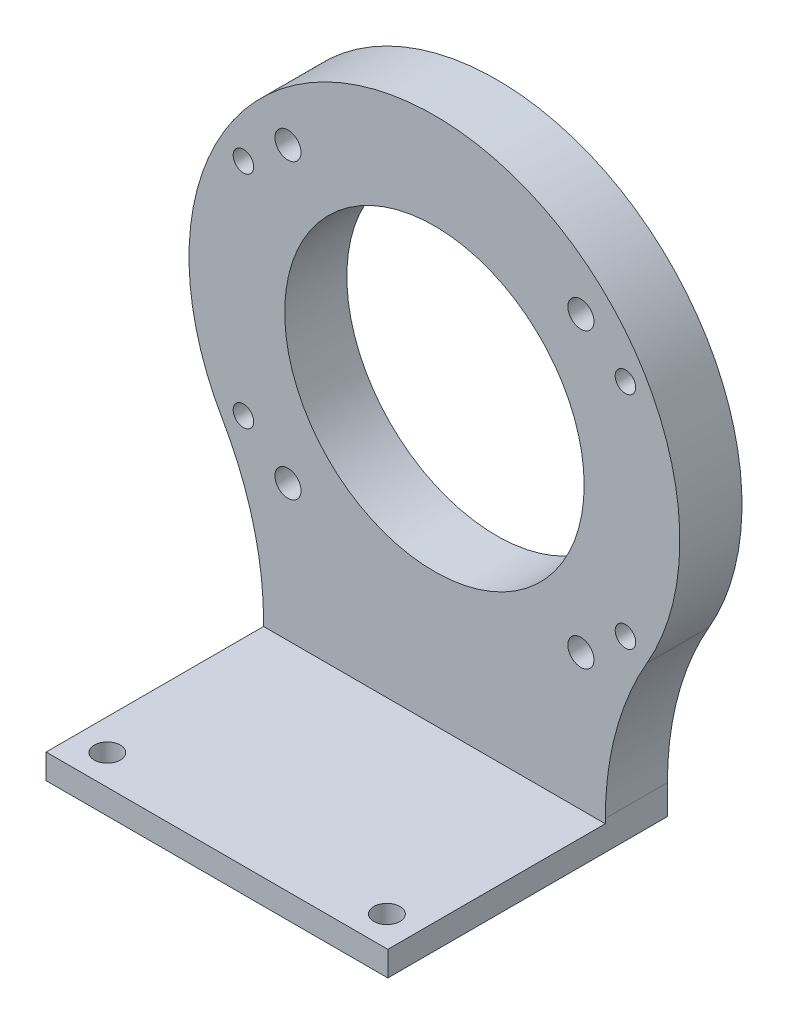
ISO-10303-21;
HEADER;
FILE_DESCRIPTION(('STEP AP214'),'2;1');
FILE_NAME('part.step','',(''),(''),'','','');
FILE_SCHEMA(('AUTOMOTIVE_DESIGN { 1 0 10303 214 1 1 1 1 }'));
ENDSEC;
DATA;
#1=APPLICATION_CONTEXT('core data for automotive mechanical design processes');
#2=APPLICATION_PROTOCOL_DEFINITION('international standard','automotive_design',2000,#1);
#3=PRODUCT_CONTEXT('',#1,'mechanical');
#4=PRODUCT('Part','Part','',(#3));
#5=PRODUCT_RELATED_PRODUCT_CATEGORY('part','',(#4));
#6=PRODUCT_DEFINITION_FORMATION('','',#4);
#7=PRODUCT_DEFINITION_CONTEXT('part definition',#1,'design');
#8=PRODUCT_DEFINITION('design','',#6,#7);
#9=PRODUCT_DEFINITION_SHAPE('','',#8);
#10=(LENGTH_UNIT() NAMED_UNIT(*) SI_UNIT(.MILLI.,.METRE.));
#11=(NAMED_UNIT(*) PLANE_ANGLE_UNIT() SI_UNIT($,.RADIAN.));
#12=(NAMED_UNIT(*) SI_UNIT($,.STERADIAN.) SOLID_ANGLE_UNIT());
#13=UNCERTAINTY_MEASURE_WITH_UNIT(LENGTH_MEASURE(1.E-05),#10,'distance_accuracy_value','');
#14=(GEOMETRIC_REPRESENTATION_CONTEXT(3) GLOBAL_UNCERTAINTY_ASSIGNED_CONTEXT((#13)) GLOBAL_UNIT_ASSIGNED_CONTEXT((#10,
#11,#12)) REPRESENTATION_CONTEXT('',''));
#15=CARTESIAN_POINT('',(0.,0.,0.));
#16=DIRECTION('',(0.,0.,1.));
#17=DIRECTION('',(1.,0.,0.));
#18=AXIS2_PLACEMENT_3D('',#15,#16,#17);
#19=CARTESIAN_POINT('',(0.,0.,10.));
#20=DIRECTION('',(0.,0.,1.));
#21=DIRECTION('',(1.,0.,0.));
#22=AXIS2_PLACEMENT_3D('',#19,#20,#21);
#23=PLANE('',#22);
#24=CARTESIAN_POINT('',(-30.7439018343476,-17.75,10.));
#25=DIRECTION('',(0.,0.,1.));
#26=DIRECTION('',(1.,0.,0.));
#27=AXIS2_PLACEMENT_3D('',#24,#25,#26);
#28=CIRCLE('',#27,1.65);
#29=CARTESIAN_POINT('',(-29.0939018343476,-17.75,10.));
#30=VERTEX_POINT('',#29);
#31=EDGE_CURVE('E184',#30,#30,#28,.T.);
#32=ORIENTED_EDGE('',*,*,#31,.F.);
#33=EDGE_LOOP('',(#32));
#34=FACE_BOUND('',#33,.T.);
#35=CARTESIAN_POINT('',(-30.7439018343476,17.75,10.));
#36=DIRECTION('',(0.,0.,1.));
#37=DIRECTION('',(1.,0.,0.));
#38=AXIS2_PLACEMENT_3D('',#35,#36,#37);
#39=CIRCLE('',#38,1.65);
#40=CARTESIAN_POINT('',(-29.0939018343476,17.75,10.));
#41=VERTEX_POINT('',#40);
#42=EDGE_CURVE('E192',#41,#41,#39,.T.);
#43=ORIENTED_EDGE('',*,*,#42,.F.);
#44=EDGE_LOOP('',(#43));
#45=FACE_BOUND('',#44,.T.);
#46=CARTESIAN_POINT('',(30.7439018343476,17.75,10.));
#47=DIRECTION('',(0.,0.,1.));
#48=DIRECTION('',(1.,0.,0.));
#49=AXIS2_PLACEMENT_3D('',#46,#47,#48);
#50=CIRCLE('',#49,1.65);
#51=CARTESIAN_POINT('',(32.3939018343476,17.75,10.));
#52=VERTEX_POINT('',#51);
#53=EDGE_CURVE('E200',#52,#52,#50,.T.);
#54=ORIENTED_EDGE('',*,*,#53,.F.);
#55=EDGE_LOOP('',(#54));
#56=FACE_BOUND('',#55,.T.);
#57=CARTESIAN_POINT('',(30.7439018343476,-17.75,10.));
#58=DIRECTION('',(0.,0.,1.));
#59=DIRECTION('',(1.,0.,0.));
#60=AXIS2_PLACEMENT_3D('',#57,#58,#59);
#61=CIRCLE('',#60,1.65);
#62=CARTESIAN_POINT('',(32.3939018343476,-17.75,10.));
#63=VERTEX_POINT('',#62);
#64=EDGE_CURVE('E208',#63,#63,#61,.T.);
#65=ORIENTED_EDGE('',*,*,#64,.F.);
#66=EDGE_LOOP('',(#65));
#67=FACE_BOUND('',#66,.T.);
#68=CARTESIAN_POINT('',(23.5731723178065,23.5731723178065,10.));
#69=DIRECTION('',(0.,0.,-1.));
#70=DIRECTION('',(-1.,0.,0.));
#71=AXIS2_PLACEMENT_3D('',#68,#69,#70);
#72=CIRCLE('',#71,2.1);
#73=CARTESIAN_POINT('',(21.4731723178065,23.5731723178065,10.));
#74=VERTEX_POINT('',#73);
#75=EDGE_CURVE('E220',#74,#74,#72,.T.);
#76=ORIENTED_EDGE('',*,*,#75,.T.);
#77=EDGE_LOOP('',(#76));
#78=FACE_BOUND('',#77,.T.);
#79=CARTESIAN_POINT('',(-23.5731723178065,23.5731723178065,10.));
#80=DIRECTION('',(0.,0.,-1.));
#81=DIRECTION('',(-1.,0.,0.));
#82=AXIS2_PLACEMENT_3D('',#79,#80,#81);
#83=CIRCLE('',#82,2.1);
#84=CARTESIAN_POINT('',(-25.6731723178065,23.5731723178065,10.));
#85=VERTEX_POINT('',#84);
#86=EDGE_CURVE('E228',#85,#85,#83,.T.);
#87=ORIENTED_EDGE('',*,*,#86,.T.);
#88=EDGE_LOOP('',(#87));
#89=FACE_BOUND('',#88,.T.);
#90=CARTESIAN_POINT('',(-23.5731723178065,-23.5731723178065,10.));
#91=DIRECTION('',(0.,0.,-1.));
#92=DIRECTION('',(-1.,0.,0.));
#93=AXIS2_PLACEMENT_3D('',#90,#91,#92);
#94=CIRCLE('',#93,2.1);
#95=CARTESIAN_POINT('',(-25.6731723178065,-23.5731723178065,10.));
#96=VERTEX_POINT('',#95);
#97=EDGE_CURVE('E236',#96,#96,#94,.T.);
#98=ORIENTED_EDGE('',*,*,#97,.T.);
#99=EDGE_LOOP('',(#98));
#100=FACE_BOUND('',#99,.T.);
#101=CARTESIAN_POINT('',(23.5731723178065,-23.5731723178065,10.));
#102=DIRECTION('',(0.,0.,-1.));
#103=DIRECTION('',(-1.,0.,0.));
#104=AXIS2_PLACEMENT_3D('',#101,#102,#103);
#105=CIRCLE('',#104,2.1);
#106=CARTESIAN_POINT('',(21.4731723178065,-23.5731723178065,10.));
#107=VERTEX_POINT('',#106);
#108=EDGE_CURVE('E244',#107,#107,#105,.T.);
#109=ORIENTED_EDGE('',*,*,#108,.T.);
#110=EDGE_LOOP('',(#109));
#111=FACE_BOUND('',#110,.T.);
#112=DIRECTION('',(0.,1.,0.));
#113=VECTOR('',#112,1.);
#114=CARTESIAN_POINT('',(27.5,-28.3548937575156,10.));
#115=LINE('',#114,#113);
#116=CARTESIAN_POINT('',(27.5,-45.5,10.));
#117=VERTEX_POINT('',#116);
#118=CARTESIAN_POINT('',(27.5,-44.7660585711988,10.));
#119=VERTEX_POINT('',#118);
#120=EDGE_CURVE('E272',#117,#119,#115,.T.);
#121=ORIENTED_EDGE('',*,*,#120,.T.);
#122=CARTESIAN_POINT('',(77.5,-44.7660585711988,10.));
#123=DIRECTION('',(0.,0.,1.));
#124=DIRECTION('',(1.,0.,0.));
#125=AXIS2_PLACEMENT_3D('',#122,#123,#124);
#126=CIRCLE('',#125,50.);
#127=CARTESIAN_POINT('',(34.2039106145251,-19.7570873023726,10.));
#128=VERTEX_POINT('',#127);
#129=EDGE_CURVE('E11',#119,#128,#126,.F.);
#130=ORIENTED_EDGE('',*,*,#129,.T.);
#131=CARTESIAN_POINT('',(0.,0.,10.));
#132=DIRECTION('',(0.,0.,1.));
#133=DIRECTION('',(1.,0.,0.));
#134=AXIS2_PLACEMENT_3D('',#131,#132,#133);
#135=CIRCLE('',#134,39.5);
#136=CARTESIAN_POINT('',(-34.2039106145251,-19.7570873023726,10.));
#137=VERTEX_POINT('',#136);
#138=EDGE_CURVE('E257',#128,#137,#135,.T.);
#139=ORIENTED_EDGE('',*,*,#138,.T.);
#140=CARTESIAN_POINT('',(-77.5,-44.7660585711988,10.));
#141=DIRECTION('',(0.,0.,1.));
#142=DIRECTION('',(1.,0.,0.));
#143=AXIS2_PLACEMENT_3D('',#140,#141,#142);
#144=CIRCLE('',#143,50.);
#145=CARTESIAN_POINT('',(-27.5,-44.7660585711988,10.));
#146=VERTEX_POINT('',#145);
#147=EDGE_CURVE('E299',#137,#146,#144,.F.);
#148=ORIENTED_EDGE('',*,*,#147,.T.);
#149=DIRECTION('',(0.,-1.,0.));
#150=VECTOR('',#149,1.);
#151=CARTESIAN_POINT('',(-27.5,-28.3548937575156,10.));
#152=LINE('',#151,#150);
#153=CARTESIAN_POINT('',(-27.5,-45.5,9.99999999999999));
#154=VERTEX_POINT('',#153);
#155=EDGE_CURVE('E261',#146,#154,#152,.T.);
#156=ORIENTED_EDGE('',*,*,#155,.T.);
#157=DIRECTION('',(1.,0.,0.));
#158=VECTOR('',#157,1.);
#159=CARTESIAN_POINT('',(-27.5,-45.5,10.));
#160=LINE('',#159,#158);
#161=EDGE_CURVE('E267',#154,#117,#160,.T.);
#162=ORIENTED_EDGE('',*,*,#161,.T.);
#163=EDGE_LOOP('',(#121,#130,#139,#148,#156,#162));
#164=FACE_BOUND('',#163,.T.);
#165=CARTESIAN_POINT('',(0.,0.,10.));
#166=DIRECTION('',(0.,0.,1.));
#167=DIRECTION('',(1.,0.,0.));
#168=AXIS2_PLACEMENT_3D('',#165,#166,#167);
#169=CIRCLE('',#168,24.1);
#170=CARTESIAN_POINT('',(24.1,0.,10.));
#171=VERTEX_POINT('',#170);
#172=EDGE_CURVE('E249',#171,#171,#169,.T.);
#173=ORIENTED_EDGE('',*,*,#172,.F.);
#174=EDGE_LOOP('',(#173));
#175=FACE_BOUND('',#174,.T.);
#176=ADVANCED_FACE('F41',(#34,#45,#56,#67,#78,#89,#100,#111,#164,#175),#23,.T.);
#177=CARTESIAN_POINT('',(0.,0.,0.));
#178=DIRECTION('',(0.,0.,1.));
#179=DIRECTION('',(1.,0.,0.));
#180=AXIS2_PLACEMENT_3D('',#177,#178,#179);
#181=PLANE('',#180);
#182=CARTESIAN_POINT('',(-30.7439018343476,-17.75,0.));
#183=DIRECTION('',(0.,0.,1.));
#184=DIRECTION('',(1.,0.,0.));
#185=AXIS2_PLACEMENT_3D('',#182,#183,#184);
#186=CIRCLE('',#185,1.65);
#187=CARTESIAN_POINT('',(-29.0939018343476,-17.75,0.));
#188=VERTEX_POINT('',#187);
#189=EDGE_CURVE('E188',#188,#188,#186,.T.);
#190=ORIENTED_EDGE('',*,*,#189,.T.);
#191=EDGE_LOOP('',(#190));
#192=FACE_BOUND('',#191,.T.);
#193=CARTESIAN_POINT('',(-30.7439018343476,17.75,0.));
#194=DIRECTION('',(0.,0.,1.));
#195=DIRECTION('',(1.,0.,0.));
#196=AXIS2_PLACEMENT_3D('',#193,#194,#195);
#197=CIRCLE('',#196,1.65);
#198=CARTESIAN_POINT('',(-29.0939018343476,17.75,0.));
#199=VERTEX_POINT('',#198);
#200=EDGE_CURVE('E196',#199,#199,#197,.T.);
#201=ORIENTED_EDGE('',*,*,#200,.T.);
#202=EDGE_LOOP('',(#201));
#203=FACE_BOUND('',#202,.T.);
#204=CARTESIAN_POINT('',(30.7439018343476,17.75,0.));
#205=DIRECTION('',(0.,0.,1.));
#206=DIRECTION('',(1.,0.,0.));
#207=AXIS2_PLACEMENT_3D('',#204,#205,#206);
#208=CIRCLE('',#207,1.65);
#209=CARTESIAN_POINT('',(32.3939018343476,17.75,0.));
#210=VERTEX_POINT('',#209);
#211=EDGE_CURVE('E204',#210,#210,#208,.T.);
#212=ORIENTED_EDGE('',*,*,#211,.T.);
#213=EDGE_LOOP('',(#212));
#214=FACE_BOUND('',#213,.T.);
#215=CARTESIAN_POINT('',(30.7439018343476,-17.75,0.));
#216=DIRECTION('',(0.,0.,1.));
#217=DIRECTION('',(1.,0.,0.));
#218=AXIS2_PLACEMENT_3D('',#215,#216,#217);
#219=CIRCLE('',#218,1.65);
#220=CARTESIAN_POINT('',(32.3939018343476,-17.75,0.));
#221=VERTEX_POINT('',#220);
#222=EDGE_CURVE('E212',#221,#221,#219,.T.);
#223=ORIENTED_EDGE('',*,*,#222,.T.);
#224=EDGE_LOOP('',(#223));
#225=FACE_BOUND('',#224,.T.);
#226=CARTESIAN_POINT('',(23.5731723178065,23.5731723178065,0.));
#227=DIRECTION('',(0.,0.,-1.));
#228=DIRECTION('',(-1.,0.,0.));
#229=AXIS2_PLACEMENT_3D('',#226,#227,#228);
#230=CIRCLE('',#229,2.1);
#231=CARTESIAN_POINT('',(21.4731723178065,23.5731723178065,0.));
#232=VERTEX_POINT('',#231);
#233=EDGE_CURVE('E216',#232,#232,#230,.T.);
#234=ORIENTED_EDGE('',*,*,#233,.F.);
#235=EDGE_LOOP('',(#234));
#236=FACE_BOUND('',#235,.T.);
#237=CARTESIAN_POINT('',(-23.5731723178065,23.5731723178065,0.));
#238=DIRECTION('',(0.,0.,-1.));
#239=DIRECTION('',(-1.,0.,0.));
#240=AXIS2_PLACEMENT_3D('',#237,#238,#239);
#241=CIRCLE('',#240,2.1);
#242=CARTESIAN_POINT('',(-25.6731723178065,23.5731723178065,0.));
#243=VERTEX_POINT('',#242);
#244=EDGE_CURVE('E224',#243,#243,#241,.T.);
#245=ORIENTED_EDGE('',*,*,#244,.F.);
#246=EDGE_LOOP('',(#245));
#247=FACE_BOUND('',#246,.T.);
#248=CARTESIAN_POINT('',(-23.5731723178065,-23.5731723178065,0.));
#249=DIRECTION('',(0.,0.,-1.));
#250=DIRECTION('',(-1.,0.,0.));
#251=AXIS2_PLACEMENT_3D('',#248,#249,#250);
#252=CIRCLE('',#251,2.1);
#253=CARTESIAN_POINT('',(-25.6731723178065,-23.5731723178065,0.));
#254=VERTEX_POINT('',#253);
#255=EDGE_CURVE('E232',#254,#254,#252,.T.);
#256=ORIENTED_EDGE('',*,*,#255,.F.);
#257=EDGE_LOOP('',(#256));
#258=FACE_BOUND('',#257,.T.);
#259=CARTESIAN_POINT('',(23.5731723178065,-23.5731723178065,0.));
#260=DIRECTION('',(0.,0.,-1.));
#261=DIRECTION('',(-1.,0.,0.));
#262=AXIS2_PLACEMENT_3D('',#259,#260,#261);
#263=CIRCLE('',#262,2.1);
#264=CARTESIAN_POINT('',(21.4731723178065,-23.5731723178065,0.));
#265=VERTEX_POINT('',#264);
#266=EDGE_CURVE('E240',#265,#265,#263,.T.);
#267=ORIENTED_EDGE('',*,*,#266,.F.);
#268=EDGE_LOOP('',(#267));
#269=FACE_BOUND('',#268,.T.);
#270=CARTESIAN_POINT('',(0.,0.,0.));
#271=DIRECTION('',(0.,0.,1.));
#272=DIRECTION('',(1.,0.,0.));
#273=AXIS2_PLACEMENT_3D('',#270,#271,#272);
#274=CIRCLE('',#273,39.5);
#275=CARTESIAN_POINT('',(34.2039106145251,-19.7570873023726,0.));
#276=VERTEX_POINT('',#275);
#277=CARTESIAN_POINT('',(-34.2039106145251,-19.7570873023726,0.));
#278=VERTEX_POINT('',#277);
#279=EDGE_CURVE('E253',#276,#278,#274,.T.);
#280=ORIENTED_EDGE('',*,*,#279,.F.);
#281=CARTESIAN_POINT('',(77.5,-44.7660585711988,0.));
#282=DIRECTION('',(0.,0.,1.));
#283=DIRECTION('',(1.,0.,0.));
#284=AXIS2_PLACEMENT_3D('',#281,#282,#283);
#285=CIRCLE('',#284,50.);
#286=CARTESIAN_POINT('',(27.5,-44.7660585711988,0.));
#287=VERTEX_POINT('',#286);
#288=EDGE_CURVE('E50',#276,#287,#285,.T.);
#289=ORIENTED_EDGE('',*,*,#288,.T.);
#290=DIRECTION('',(0.,1.,0.));
#291=VECTOR('',#290,1.);
#292=CARTESIAN_POINT('',(27.5,-28.3548937575156,0.));
#293=LINE('',#292,#291);
#294=CARTESIAN_POINT('',(27.5,-49.5,0.));
#295=VERTEX_POINT('',#294);
#296=EDGE_CURVE('E262',#295,#287,#293,.T.);
#297=ORIENTED_EDGE('',*,*,#296,.F.);
#298=DIRECTION('',(1.,0.,0.));
#299=VECTOR('',#298,1.);
#300=CARTESIAN_POINT('',(-27.5,-49.5,0.));
#301=LINE('',#300,#299);
#302=CARTESIAN_POINT('',(-27.5,-49.5,0.));
#303=VERTEX_POINT('',#302);
#304=EDGE_CURVE('E158',#303,#295,#301,.T.);
#305=ORIENTED_EDGE('',*,*,#304,.F.);
#306=DIRECTION('',(0.,-1.,0.));
#307=VECTOR('',#306,1.);
#308=CARTESIAN_POINT('',(-27.5,-28.3548937575156,0.));
#309=LINE('',#308,#307);
#310=CARTESIAN_POINT('',(-27.5,-44.7660585711988,0.));
#311=VERTEX_POINT('',#310);
#312=EDGE_CURVE('E306',#311,#303,#309,.T.);
#313=ORIENTED_EDGE('',*,*,#312,.F.);
#314=CARTESIAN_POINT('',(-77.5,-44.7660585711988,0.));
#315=DIRECTION('',(0.,0.,1.));
#316=DIRECTION('',(1.,0.,0.));
#317=AXIS2_PLACEMENT_3D('',#314,#315,#316);
#318=CIRCLE('',#317,50.);
#319=EDGE_CURVE('E296',#311,#278,#318,.T.);
#320=ORIENTED_EDGE('',*,*,#319,.T.);
#321=EDGE_LOOP('',(#280,#289,#297,#305,#313,#320));
#322=FACE_BOUND('',#321,.T.);
#323=CARTESIAN_POINT('',(0.,0.,0.));
#324=DIRECTION('',(0.,0.,1.));
#325=DIRECTION('',(1.,0.,0.));
#326=AXIS2_PLACEMENT_3D('',#323,#324,#325);
#327=CIRCLE('',#326,24.1);
#328=CARTESIAN_POINT('',(24.1,0.,0.));
#329=VERTEX_POINT('',#328);
#330=EDGE_CURVE('E248',#329,#329,#327,.T.);
#331=ORIENTED_EDGE('',*,*,#330,.T.);
#332=EDGE_LOOP('',(#331));
#333=FACE_BOUND('',#332,.T.);
#334=ADVANCED_FACE('F356',(#192,#203,#214,#225,#236,#247,#258,#269,#322,#333),#181,.F.);
#335=CARTESIAN_POINT('',(0.,0.,10.));
#336=DIRECTION('',(0.,0.,-1.));
#337=DIRECTION('',(-1.,0.,0.));
#338=AXIS2_PLACEMENT_3D('',#335,#336,#337);
#339=CYLINDRICAL_SURFACE('',#338,39.5);
#340=ORIENTED_EDGE('',*,*,#279,.T.);
#341=DIRECTION('',(0.,0.,-1.));
#342=VECTOR('',#341,1.);
#343=CARTESIAN_POINT('',(-34.2039106145251,-19.7570873023726,10.));
#344=LINE('',#343,#342);
#345=EDGE_CURVE('E291',#278,#137,#344,.F.);
#346=ORIENTED_EDGE('',*,*,#345,.T.);
#347=ORIENTED_EDGE('',*,*,#138,.F.);
#348=DIRECTION('',(0.,0.,-1.));
#349=VECTOR('',#348,1.);
#350=CARTESIAN_POINT('',(34.2039106145251,-19.7570873023726,10.));
#351=LINE('',#350,#349);
#352=EDGE_CURVE('E287',#128,#276,#351,.T.);
#353=ORIENTED_EDGE('',*,*,#352,.T.);
#354=EDGE_LOOP('',(#340,#346,#347,#353));
#355=FACE_BOUND('',#354,.T.);
#356=ADVANCED_FACE('F323',(#355),#339,.T.);
#357=CARTESIAN_POINT('',(-27.5,-28.3548937575156,10.));
#358=DIRECTION('',(1.,0.,0.));
#359=DIRECTION('',(0.,1.,0.));
#360=AXIS2_PLACEMENT_3D('',#357,#358,#359);
#361=PLANE('',#360);
#362=ORIENTED_EDGE('',*,*,#155,.F.);
#363=DIRECTION('',(0.,0.,1.));
#364=VECTOR('',#363,1.);
#365=CARTESIAN_POINT('',(-27.5,-44.7660585711988,0.));
#366=LINE('',#365,#364);
#367=EDGE_CURVE('E275',#146,#311,#366,.F.);
#368=ORIENTED_EDGE('',*,*,#367,.T.);
#369=ORIENTED_EDGE('',*,*,#312,.T.);
#370=DIRECTION('',(0.,0.,-1.));
#371=VECTOR('',#370,1.);
#372=CARTESIAN_POINT('',(-27.5,-49.5,0.));
#373=LINE('',#372,#371);
#374=CARTESIAN_POINT('',(-27.5,-49.5,45.));
#375=VERTEX_POINT('',#374);
#376=EDGE_CURVE('E154',#375,#303,#373,.T.);
#377=ORIENTED_EDGE('',*,*,#376,.F.);
#378=DIRECTION('',(0.,1.,0.));
#379=VECTOR('',#378,1.);
#380=CARTESIAN_POINT('',(-27.5,-49.5,45.));
#381=LINE('',#380,#379);
#382=CARTESIAN_POINT('',(-27.5,-45.5,45.));
#383=VERTEX_POINT('',#382);
#384=EDGE_CURVE('E169',#375,#383,#381,.T.);
#385=ORIENTED_EDGE('',*,*,#384,.T.);
#386=DIRECTION('',(0.,0.,-1.));
#387=VECTOR('',#386,1.);
#388=CARTESIAN_POINT('',(-27.5,-45.5,0.));
#389=LINE('',#388,#387);
#390=EDGE_CURVE('E153',#383,#154,#389,.T.);
#391=ORIENTED_EDGE('',*,*,#390,.T.);
#392=EDGE_LOOP('',(#362,#368,#369,#377,#385,#391));
#393=FACE_BOUND('',#392,.T.);
#394=ADVANCED_FACE('F334',(#393),#361,.F.);
#395=CARTESIAN_POINT('',(27.5,-28.3548937575156,10.));
#396=DIRECTION('',(-1.,0.,0.));
#397=DIRECTION('',(0.,-1.,0.));
#398=AXIS2_PLACEMENT_3D('',#395,#396,#397);
#399=PLANE('',#398);
#400=ORIENTED_EDGE('',*,*,#296,.T.);
#401=DIRECTION('',(0.,0.,1.));
#402=VECTOR('',#401,1.);
#403=CARTESIAN_POINT('',(27.5,-44.7660585711988,10.));
#404=LINE('',#403,#402);
#405=EDGE_CURVE('E60',#287,#119,#404,.T.);
#406=ORIENTED_EDGE('',*,*,#405,.T.);
#407=ORIENTED_EDGE('',*,*,#120,.F.);
#408=DIRECTION('',(0.,0.,1.));
#409=VECTOR('',#408,1.);
#410=CARTESIAN_POINT('',(27.5,-45.5,0.));
#411=LINE('',#410,#409);
#412=CARTESIAN_POINT('',(27.5,-45.5,45.));
#413=VERTEX_POINT('',#412);
#414=EDGE_CURVE('E179',#117,#413,#411,.T.);
#415=ORIENTED_EDGE('',*,*,#414,.T.);
#416=DIRECTION('',(0.,1.,0.));
#417=VECTOR('',#416,1.);
#418=CARTESIAN_POINT('',(27.5,-49.5,45.));
#419=LINE('',#418,#417);
#420=CARTESIAN_POINT('',(27.5,-49.5,45.));
#421=VERTEX_POINT('',#420);
#422=EDGE_CURVE('E180',#421,#413,#419,.T.);
#423=ORIENTED_EDGE('',*,*,#422,.F.);
#424=DIRECTION('',(0.,0.,1.));
#425=VECTOR('',#424,1.);
#426=CARTESIAN_POINT('',(27.5,-49.5,0.));
#427=LINE('',#426,#425);
#428=EDGE_CURVE('E163',#295,#421,#427,.T.);
#429=ORIENTED_EDGE('',*,*,#428,.F.);
#430=EDGE_LOOP('',(#400,#406,#407,#415,#423,#429));
#431=FACE_BOUND('',#430,.T.);
#432=ADVANCED_FACE('F341',(#431),#399,.F.);
#433=CARTESIAN_POINT('',(0.,0.,10.));
#434=DIRECTION('',(0.,0.,-1.));
#435=DIRECTION('',(-1.,0.,0.));
#436=AXIS2_PLACEMENT_3D('',#433,#434,#435);
#437=CYLINDRICAL_SURFACE('',#436,24.1);
#438=ORIENTED_EDGE('',*,*,#172,.T.);
#439=EDGE_LOOP('',(#438));
#440=FACE_BOUND('',#439,.T.);
#441=ORIENTED_EDGE('',*,*,#330,.F.);
#442=EDGE_LOOP('',(#441));
#443=FACE_BOUND('',#442,.T.);
#444=ADVANCED_FACE('F367',(#440,#443),#437,.F.);
#445=CARTESIAN_POINT('',(23.5731723178065,-23.5731723178065,0.));
#446=DIRECTION('',(0.,0.,-1.));
#447=DIRECTION('',(-1.,0.,0.));
#448=AXIS2_PLACEMENT_3D('',#445,#446,#447);
#449=CYLINDRICAL_SURFACE('',#448,2.1);
#450=ORIENTED_EDGE('',*,*,#108,.F.);
#451=EDGE_LOOP('',(#450));
#452=FACE_BOUND('',#451,.T.);
#453=ORIENTED_EDGE('',*,*,#266,.T.);
#454=EDGE_LOOP('',(#453));
#455=FACE_BOUND('',#454,.T.);
#456=ADVANCED_FACE('F393',(#452,#455),#449,.F.);
#457=CARTESIAN_POINT('',(-23.5731723178065,-23.5731723178065,0.));
#458=DIRECTION('',(0.,0.,-1.));
#459=DIRECTION('',(-1.,0.,0.));
#460=AXIS2_PLACEMENT_3D('',#457,#458,#459);
#461=CYLINDRICAL_SURFACE('',#460,2.1);
#462=ORIENTED_EDGE('',*,*,#97,.F.);
#463=EDGE_LOOP('',(#462));
#464=FACE_BOUND('',#463,.T.);
#465=ORIENTED_EDGE('',*,*,#255,.T.);
#466=EDGE_LOOP('',(#465));
#467=FACE_BOUND('',#466,.T.);
#468=ADVANCED_FACE('F400',(#464,#467),#461,.F.);
#469=CARTESIAN_POINT('',(-23.5731723178065,23.5731723178065,0.));
#470=DIRECTION('',(0.,0.,-1.));
#471=DIRECTION('',(-1.,0.,0.));
#472=AXIS2_PLACEMENT_3D('',#469,#470,#471);
#473=CYLINDRICAL_SURFACE('',#472,2.1);
#474=ORIENTED_EDGE('',*,*,#86,.F.);
#475=EDGE_LOOP('',(#474));
#476=FACE_BOUND('',#475,.T.);
#477=ORIENTED_EDGE('',*,*,#244,.T.);
#478=EDGE_LOOP('',(#477));
#479=FACE_BOUND('',#478,.T.);
#480=ADVANCED_FACE('F408',(#476,#479),#473,.F.);
#481=CARTESIAN_POINT('',(23.5731723178065,23.5731723178065,0.));
#482=DIRECTION('',(0.,0.,-1.));
#483=DIRECTION('',(-1.,0.,0.));
#484=AXIS2_PLACEMENT_3D('',#481,#482,#483);
#485=CYLINDRICAL_SURFACE('',#484,2.1);
#486=ORIENTED_EDGE('',*,*,#75,.F.);
#487=EDGE_LOOP('',(#486));
#488=FACE_BOUND('',#487,.T.);
#489=ORIENTED_EDGE('',*,*,#233,.T.);
#490=EDGE_LOOP('',(#489));
#491=FACE_BOUND('',#490,.T.);
#492=ADVANCED_FACE('F414',(#488,#491),#485,.F.);
#493=CARTESIAN_POINT('',(30.7439018343476,-17.75,10.));
#494=DIRECTION('',(0.,0.,1.));
#495=DIRECTION('',(1.,0.,0.));
#496=AXIS2_PLACEMENT_3D('',#493,#494,#495);
#497=CYLINDRICAL_SURFACE('',#496,1.65);
#498=ORIENTED_EDGE('',*,*,#222,.F.);
#499=EDGE_LOOP('',(#498));
#500=FACE_BOUND('',#499,.T.);
#501=ORIENTED_EDGE('',*,*,#64,.T.);
#502=EDGE_LOOP('',(#501));
#503=FACE_BOUND('',#502,.T.);
#504=ADVANCED_FACE('F422',(#500,#503),#497,.F.);
#505=CARTESIAN_POINT('',(30.7439018343476,17.75,10.));
#506=DIRECTION('',(0.,0.,1.));
#507=DIRECTION('',(1.,0.,0.));
#508=AXIS2_PLACEMENT_3D('',#505,#506,#507);
#509=CYLINDRICAL_SURFACE('',#508,1.65);
#510=ORIENTED_EDGE('',*,*,#211,.F.);
#511=EDGE_LOOP('',(#510));
#512=FACE_BOUND('',#511,.T.);
#513=ORIENTED_EDGE('',*,*,#53,.T.);
#514=EDGE_LOOP('',(#513));
#515=FACE_BOUND('',#514,.T.);
#516=ADVANCED_FACE('F430',(#512,#515),#509,.F.);
#517=CARTESIAN_POINT('',(-30.7439018343476,17.75,10.));
#518=DIRECTION('',(0.,0.,1.));
#519=DIRECTION('',(1.,0.,0.));
#520=AXIS2_PLACEMENT_3D('',#517,#518,#519);
#521=CYLINDRICAL_SURFACE('',#520,1.65);
#522=ORIENTED_EDGE('',*,*,#200,.F.);
#523=EDGE_LOOP('',(#522));
#524=FACE_BOUND('',#523,.T.);
#525=ORIENTED_EDGE('',*,*,#42,.T.);
#526=EDGE_LOOP('',(#525));
#527=FACE_BOUND('',#526,.T.);
#528=ADVANCED_FACE('F438',(#524,#527),#521,.F.);
#529=CARTESIAN_POINT('',(-30.7439018343476,-17.75,10.));
#530=DIRECTION('',(0.,0.,1.));
#531=DIRECTION('',(1.,0.,0.));
#532=AXIS2_PLACEMENT_3D('',#529,#530,#531);
#533=CYLINDRICAL_SURFACE('',#532,1.65);
#534=ORIENTED_EDGE('',*,*,#189,.F.);
#535=EDGE_LOOP('',(#534));
#536=FACE_BOUND('',#535,.T.);
#537=ORIENTED_EDGE('',*,*,#31,.T.);
#538=EDGE_LOOP('',(#537));
#539=FACE_BOUND('',#538,.T.);
#540=ADVANCED_FACE('F446',(#536,#539),#533,.F.);
#541=CARTESIAN_POINT('',(0.,-45.5,0.));
#542=DIRECTION('',(0.,1.,0.));
#543=DIRECTION('',(0.,0.,1.));
#544=AXIS2_PLACEMENT_3D('',#541,#542,#543);
#545=PLANE('',#544);
#546=CARTESIAN_POINT('',(-22.5,-45.5,40.1527425499316));
#547=DIRECTION('',(0.,1.,0.));
#548=DIRECTION('',(0.,0.,1.));
#549=AXIS2_PLACEMENT_3D('',#546,#547,#548);
#550=CIRCLE('',#549,2.09999999999999);
#551=CARTESIAN_POINT('',(-22.5,-45.5,42.2527425499316));
#552=VERTEX_POINT('',#551);
#553=EDGE_CURVE('E280',#552,#552,#550,.T.);
#554=ORIENTED_EDGE('',*,*,#553,.F.);
#555=EDGE_LOOP('',(#554));
#556=FACE_BOUND('',#555,.T.);
#557=CARTESIAN_POINT('',(22.5,-45.5,40.1527425499316));
#558=DIRECTION('',(0.,1.,0.));
#559=DIRECTION('',(0.,0.,1.));
#560=AXIS2_PLACEMENT_3D('',#557,#558,#559);
#561=CIRCLE('',#560,2.09999999999999);
#562=CARTESIAN_POINT('',(22.5,-45.5,42.2527425499316));
#563=VERTEX_POINT('',#562);
#564=EDGE_CURVE('E146',#563,#563,#561,.T.);
#565=ORIENTED_EDGE('',*,*,#564,.F.);
#566=EDGE_LOOP('',(#565));
#567=FACE_BOUND('',#566,.T.);
#568=ORIENTED_EDGE('',*,*,#161,.F.);
#569=ORIENTED_EDGE('',*,*,#390,.F.);
#570=DIRECTION('',(-1.,0.,0.));
#571=VECTOR('',#570,1.);
#572=CARTESIAN_POINT('',(-27.5,-45.5,45.));
#573=LINE('',#572,#571);
#574=EDGE_CURVE('E159',#413,#383,#573,.T.);
#575=ORIENTED_EDGE('',*,*,#574,.F.);
#576=ORIENTED_EDGE('',*,*,#414,.F.);
#577=EDGE_LOOP('',(#568,#569,#575,#576));
#578=FACE_BOUND('',#577,.T.);
#579=ADVANCED_FACE('F339',(#556,#567,#578),#545,.T.);
#580=CARTESIAN_POINT('',(-27.5,-49.5,45.));
#581=DIRECTION('',(0.,0.,-1.));
#582=DIRECTION('',(-1.,0.,0.));
#583=AXIS2_PLACEMENT_3D('',#580,#581,#582);
#584=PLANE('',#583);
#585=ORIENTED_EDGE('',*,*,#574,.T.);
#586=ORIENTED_EDGE('',*,*,#384,.F.);
#587=DIRECTION('',(-1.,0.,0.));
#588=VECTOR('',#587,1.);
#589=CARTESIAN_POINT('',(-27.5,-49.5,45.));
#590=LINE('',#589,#588);
#591=EDGE_CURVE('E166',#421,#375,#590,.T.);
#592=ORIENTED_EDGE('',*,*,#591,.F.);
#593=ORIENTED_EDGE('',*,*,#422,.T.);
#594=EDGE_LOOP('',(#585,#586,#592,#593));
#595=FACE_BOUND('',#594,.T.);
#596=ADVANCED_FACE('F346',(#595),#584,.F.);
#597=CARTESIAN_POINT('',(0.,-49.5,0.));
#598=DIRECTION('',(0.,1.,0.));
#599=DIRECTION('',(0.,0.,1.));
#600=AXIS2_PLACEMENT_3D('',#597,#598,#599);
#601=PLANE('',#600);
#602=CARTESIAN_POINT('',(-22.5,-49.5,40.1527425499316));
#603=DIRECTION('',(0.,-1.,0.));
#604=DIRECTION('',(0.,0.,-1.));
#605=AXIS2_PLACEMENT_3D('',#602,#603,#604);
#606=CIRCLE('',#605,2.09999999999999);
#607=CARTESIAN_POINT('',(-22.5,-49.5,38.0527425499316));
#608=VERTEX_POINT('',#607);
#609=EDGE_CURVE('E604',#608,#608,#606,.T.);
#610=ORIENTED_EDGE('',*,*,#609,.F.);
#611=EDGE_LOOP('',(#610));
#612=FACE_BOUND('',#611,.T.);
#613=CARTESIAN_POINT('',(22.5,-49.5,40.1527425499316));
#614=DIRECTION('',(0.,-1.,0.));
#615=DIRECTION('',(0.,0.,-1.));
#616=AXIS2_PLACEMENT_3D('',#613,#614,#615);
#617=CIRCLE('',#616,2.09999999999999);
#618=CARTESIAN_POINT('',(22.5,-49.5,38.0527425499316));
#619=VERTEX_POINT('',#618);
#620=EDGE_CURVE('E309',#619,#619,#617,.T.);
#621=ORIENTED_EDGE('',*,*,#620,.F.);
#622=EDGE_LOOP('',(#621));
#623=FACE_BOUND('',#622,.T.);
#624=CARTESIAN_POINT('',(22.5,-49.5,5.15274254993159));
#625=DIRECTION('',(0.,-1.,0.));
#626=DIRECTION('',(0.,0.,-1.));
#627=AXIS2_PLACEMENT_3D('',#624,#625,#626);
#628=CIRCLE('',#627,2.09999999999999);
#629=CARTESIAN_POINT('',(22.5,-49.5,3.0527425499316));
#630=VERTEX_POINT('',#629);
#631=EDGE_CURVE('E138',#630,#630,#628,.T.);
#632=ORIENTED_EDGE('',*,*,#631,.F.);
#633=EDGE_LOOP('',(#632));
#634=FACE_BOUND('',#633,.T.);
#635=CARTESIAN_POINT('',(-22.5,-49.5,5.15274254993159));
#636=DIRECTION('',(0.,-1.,0.));
#637=DIRECTION('',(0.,0.,-1.));
#638=AXIS2_PLACEMENT_3D('',#635,#636,#637);
#639=CIRCLE('',#638,2.09999999999999);
#640=CARTESIAN_POINT('',(-22.5,-49.5,3.0527425499316));
#641=VERTEX_POINT('',#640);
#642=EDGE_CURVE('E137',#641,#641,#639,.T.);
#643=ORIENTED_EDGE('',*,*,#642,.F.);
#644=EDGE_LOOP('',(#643));
#645=FACE_BOUND('',#644,.T.);
#646=ORIENTED_EDGE('',*,*,#376,.T.);
#647=ORIENTED_EDGE('',*,*,#304,.T.);
#648=ORIENTED_EDGE('',*,*,#428,.T.);
#649=ORIENTED_EDGE('',*,*,#591,.T.);
#650=EDGE_LOOP('',(#646,#647,#648,#649));
#651=FACE_BOUND('',#650,.T.);
#652=ADVANCED_FACE('F348',(#612,#623,#634,#645,#651),#601,.F.);
#653=CARTESIAN_POINT('',(-22.5,-39.5,5.15274254993159));
#654=DIRECTION('',(0.,-1.,0.));
#655=DIRECTION('',(0.,0.,-1.));
#656=AXIS2_PLACEMENT_3D('',#653,#654,#655);
#657=CONICAL_SURFACE('',#656,2.09999999999999,1.02974425867665);
#658=CARTESIAN_POINT('',(-22.5,-38.2381927000421,5.15274254993159));
#659=VERTEX_POINT('',#658);
#660=VERTEX_LOOP('',#659);
#661=FACE_BOUND('',#660,.T.);
#662=CARTESIAN_POINT('',(-22.5,-39.5,5.15274254993159));
#663=DIRECTION('',(0.,-1.,0.));
#664=DIRECTION('',(0.,0.,-1.));
#665=AXIS2_PLACEMENT_3D('',#662,#663,#664);
#666=CIRCLE('',#665,2.09999999999999);
#667=CARTESIAN_POINT('',(-22.5,-39.5,3.0527425499316));
#668=VERTEX_POINT('',#667);
#669=EDGE_CURVE('E142',#668,#668,#666,.T.);
#670=ORIENTED_EDGE('',*,*,#669,.T.);
#671=EDGE_LOOP('',(#670));
#672=FACE_BOUND('',#671,.T.);
#673=ADVANCED_FACE('F470',(#661,#672),#657,.F.);
#674=CARTESIAN_POINT('',(-22.5,-49.5,5.15274254993159));
#675=DIRECTION('',(0.,-1.,0.));
#676=DIRECTION('',(0.,0.,-1.));
#677=AXIS2_PLACEMENT_3D('',#674,#675,#676);
#678=CYLINDRICAL_SURFACE('',#677,2.09999999999999);
#679=ORIENTED_EDGE('',*,*,#669,.F.);
#680=EDGE_LOOP('',(#679));
#681=FACE_BOUND('',#680,.T.);
#682=ORIENTED_EDGE('',*,*,#642,.T.);
#683=EDGE_LOOP('',(#682));
#684=FACE_BOUND('',#683,.T.);
#685=ADVANCED_FACE('F131',(#681,#684),#678,.F.);
#686=CARTESIAN_POINT('',(22.5,-39.5,5.15274254993159));
#687=DIRECTION('',(0.,-1.,0.));
#688=DIRECTION('',(0.,0.,-1.));
#689=AXIS2_PLACEMENT_3D('',#686,#687,#688);
#690=CONICAL_SURFACE('',#689,2.09999999999999,1.02974425867665);
#691=CARTESIAN_POINT('',(22.5,-38.2381927000421,5.15274254993159));
#692=VERTEX_POINT('',#691);
#693=VERTEX_LOOP('',#692);
#694=FACE_BOUND('',#693,.T.);
#695=CARTESIAN_POINT('',(22.5,-39.5,5.15274254993159));
#696=DIRECTION('',(0.,-1.,0.));
#697=DIRECTION('',(0.,0.,-1.));
#698=AXIS2_PLACEMENT_3D('',#695,#696,#697);
#699=CIRCLE('',#698,2.09999999999999);
#700=CARTESIAN_POINT('',(22.5,-39.5,3.0527425499316));
#701=VERTEX_POINT('',#700);
#702=EDGE_CURVE('E135',#701,#701,#699,.T.);
#703=ORIENTED_EDGE('',*,*,#702,.T.);
#704=EDGE_LOOP('',(#703));
#705=FACE_BOUND('',#704,.T.);
#706=ADVANCED_FACE('F127',(#694,#705),#690,.F.);
#707=CARTESIAN_POINT('',(22.5,-49.5,5.15274254993159));
#708=DIRECTION('',(0.,-1.,0.));
#709=DIRECTION('',(0.,0.,-1.));
#710=AXIS2_PLACEMENT_3D('',#707,#708,#709);
#711=CYLINDRICAL_SURFACE('',#710,2.09999999999999);
#712=ORIENTED_EDGE('',*,*,#702,.F.);
#713=EDGE_LOOP('',(#712));
#714=FACE_BOUND('',#713,.T.);
#715=ORIENTED_EDGE('',*,*,#631,.T.);
#716=EDGE_LOOP('',(#715));
#717=FACE_BOUND('',#716,.T.);
#718=ADVANCED_FACE('F130',(#714,#717),#711,.F.);
#719=CARTESIAN_POINT('',(22.5,-49.5,40.1527425499316));
#720=DIRECTION('',(0.,-1.,0.));
#721=DIRECTION('',(0.,0.,-1.));
#722=AXIS2_PLACEMENT_3D('',#719,#720,#721);
#723=CYLINDRICAL_SURFACE('',#722,2.09999999999999);
#724=ORIENTED_EDGE('',*,*,#564,.T.);
#725=EDGE_LOOP('',(#724));
#726=FACE_BOUND('',#725,.T.);
#727=ORIENTED_EDGE('',*,*,#620,.T.);
#728=EDGE_LOOP('',(#727));
#729=FACE_BOUND('',#728,.T.);
#730=ADVANCED_FACE('F495',(#726,#729),#723,.F.);
#731=CARTESIAN_POINT('',(-22.5,-49.5,40.1527425499316));
#732=DIRECTION('',(0.,-1.,0.));
#733=DIRECTION('',(0.,0.,-1.));
#734=AXIS2_PLACEMENT_3D('',#731,#732,#733);
#735=CYLINDRICAL_SURFACE('',#734,2.09999999999999);
#736=ORIENTED_EDGE('',*,*,#553,.T.);
#737=EDGE_LOOP('',(#736));
#738=FACE_BOUND('',#737,.T.);
#739=ORIENTED_EDGE('',*,*,#609,.T.);
#740=EDGE_LOOP('',(#739));
#741=FACE_BOUND('',#740,.T.);
#742=ADVANCED_FACE('F354',(#738,#741),#735,.F.);
#743=CARTESIAN_POINT('',(-77.5,-44.7660585711988,10.));
#744=DIRECTION('',(0.,0.,-1.));
#745=DIRECTION('',(-1.,0.,0.));
#746=AXIS2_PLACEMENT_3D('',#743,#744,#745);
#747=CYLINDRICAL_SURFACE('',#746,50.);
#748=ORIENTED_EDGE('',*,*,#147,.F.);
#749=ORIENTED_EDGE('',*,*,#345,.F.);
#750=ORIENTED_EDGE('',*,*,#319,.F.);
#751=ORIENTED_EDGE('',*,*,#367,.F.);
#752=EDGE_LOOP('',(#748,#749,#750,#751));
#753=FACE_BOUND('',#752,.T.);
#754=ADVANCED_FACE('F328',(#753),#747,.F.);
#755=CARTESIAN_POINT('',(77.5,-44.7660585711988,10.));
#756=DIRECTION('',(0.,0.,-1.));
#757=DIRECTION('',(-1.,0.,0.));
#758=AXIS2_PLACEMENT_3D('',#755,#756,#757);
#759=CYLINDRICAL_SURFACE('',#758,50.);
#760=ORIENTED_EDGE('',*,*,#129,.F.);
#761=ORIENTED_EDGE('',*,*,#405,.F.);
#762=ORIENTED_EDGE('',*,*,#288,.F.);
#763=ORIENTED_EDGE('',*,*,#352,.F.);
#764=EDGE_LOOP('',(#760,#761,#762,#763));
#765=FACE_BOUND('',#764,.T.);
#766=ADVANCED_FACE('F43',(#765),#759,.F.);
#767=CLOSED_SHELL('',(#176,#334,#356,#394,#432,#444,#456,#468,#480,#492,#504,#516,#528,#540,
#579,#596,#652,#673,#685,#706,#718,#730,#742,#754,#766));
#768=MANIFOLD_SOLID_BREP('B2',#767);
#769=ADVANCED_BREP_SHAPE_REPRESENTATION('',(#18,#768),#14);
#770=SHAPE_DEFINITION_REPRESENTATION(#9,#769);
ENDSEC;
END-ISO-10303-21;
